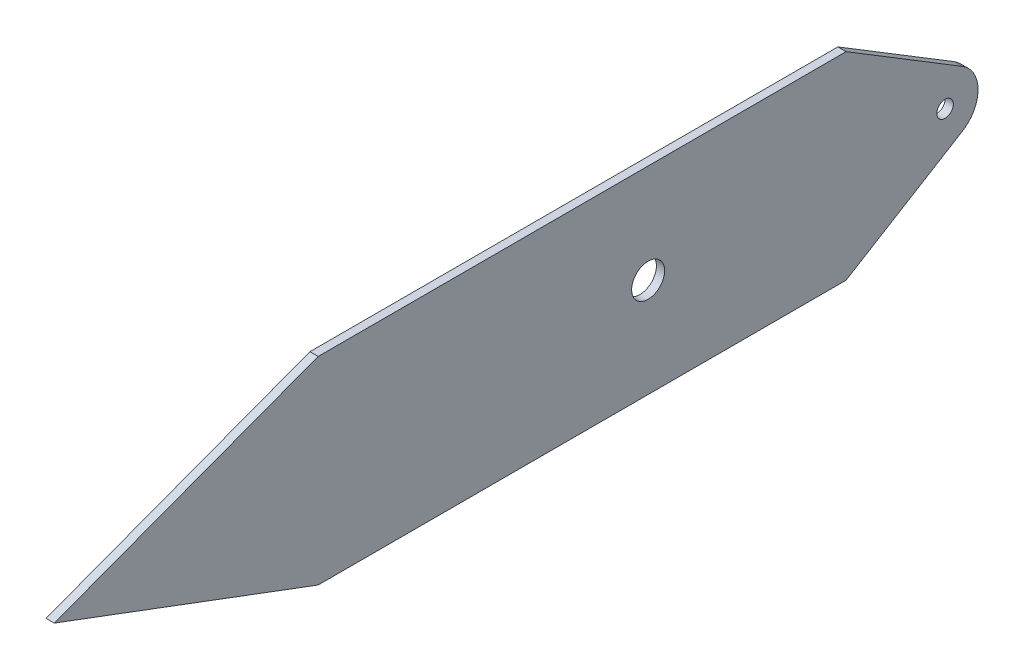
ISO-10303-21;
HEADER;
FILE_DESCRIPTION(('STEP AP214'),'2;1');
FILE_NAME('part.step','',(''),(''),'','','');
FILE_SCHEMA(('AUTOMOTIVE_DESIGN { 1 0 10303 214 1 1 1 1 }'));
ENDSEC;
DATA;
#1=APPLICATION_CONTEXT('core data for automotive mechanical design processes');
#2=APPLICATION_PROTOCOL_DEFINITION('international standard','automotive_design',2000,#1);
#3=PRODUCT_CONTEXT('',#1,'mechanical');
#4=PRODUCT('Part','Part','',(#3));
#5=PRODUCT_RELATED_PRODUCT_CATEGORY('part','',(#4));
#6=PRODUCT_DEFINITION_FORMATION('','',#4);
#7=PRODUCT_DEFINITION_CONTEXT('part definition',#1,'design');
#8=PRODUCT_DEFINITION('design','',#6,#7);
#9=PRODUCT_DEFINITION_SHAPE('','',#8);
#10=(LENGTH_UNIT() NAMED_UNIT(*) SI_UNIT(.MILLI.,.METRE.));
#11=(NAMED_UNIT(*) PLANE_ANGLE_UNIT() SI_UNIT($,.RADIAN.));
#12=(NAMED_UNIT(*) SI_UNIT($,.STERADIAN.) SOLID_ANGLE_UNIT());
#13=UNCERTAINTY_MEASURE_WITH_UNIT(LENGTH_MEASURE(1.E-05),#10,'distance_accuracy_value','');
#14=(GEOMETRIC_REPRESENTATION_CONTEXT(3) GLOBAL_UNCERTAINTY_ASSIGNED_CONTEXT((#13)) GLOBAL_UNIT_ASSIGNED_CONTEXT((#10,
#11,#12)) REPRESENTATION_CONTEXT('',''));
#15=CARTESIAN_POINT('',(0.,0.,0.));
#16=DIRECTION('',(0.,0.,1.));
#17=DIRECTION('',(1.,0.,0.));
#18=AXIS2_PLACEMENT_3D('',#15,#16,#17);
#19=CARTESIAN_POINT('',(3.175,0.,-114.3));
#20=DIRECTION('',(-1.,0.,0.));
#21=DIRECTION('',(0.,0.,1.));
#22=AXIS2_PLACEMENT_3D('',#19,#20,#21);
#23=CYLINDRICAL_SURFACE('',#22,12.7);
#24=CARTESIAN_POINT('',(0.,0.,-114.3));
#25=DIRECTION('',(1.,0.,0.));
#26=DIRECTION('',(0.,0.,-1.));
#27=AXIS2_PLACEMENT_3D('',#24,#25,#26);
#28=CIRCLE('',#27,12.7);
#29=CARTESIAN_POINT('',(0.,-10.8439069075574,-120.910573574224));
#30=VERTEX_POINT('',#29);
#31=CARTESIAN_POINT('',(0.,10.8439069075574,-120.910573574224));
#32=VERTEX_POINT('',#31);
#33=EDGE_CURVE('E138',#30,#32,#28,.T.);
#34=ORIENTED_EDGE('',*,*,#33,.T.);
#35=DIRECTION('',(-1.,0.,0.));
#36=VECTOR('',#35,1.);
#37=CARTESIAN_POINT('',(3.175,10.8439069075574,-120.910573574224));
#38=LINE('',#37,#36);
#39=CARTESIAN_POINT('',(3.175,10.8439069075574,-120.910573574224));
#40=VERTEX_POINT('',#39);
#41=EDGE_CURVE('E11',#40,#32,#38,.T.);
#42=ORIENTED_EDGE('',*,*,#41,.F.);
#43=CARTESIAN_POINT('',(3.175,0.,-114.3));
#44=DIRECTION('',(1.,0.,0.));
#45=DIRECTION('',(0.,0.,-1.));
#46=AXIS2_PLACEMENT_3D('',#43,#44,#45);
#47=CIRCLE('',#46,12.7);
#48=CARTESIAN_POINT('',(3.175,-10.8439069075574,-120.910573574224));
#49=VERTEX_POINT('',#48);
#50=EDGE_CURVE('E180',#49,#40,#47,.T.);
#51=ORIENTED_EDGE('',*,*,#50,.F.);
#52=DIRECTION('',(-1.,0.,0.));
#53=VECTOR('',#52,1.);
#54=CARTESIAN_POINT('',(3.175,-10.8439069075574,-120.910573574224));
#55=LINE('',#54,#53);
#56=EDGE_CURVE('E57',#49,#30,#55,.T.);
#57=ORIENTED_EDGE('',*,*,#56,.T.);
#58=EDGE_LOOP('',(#34,#42,#51,#57));
#59=FACE_BOUND('',#58,.T.);
#60=ADVANCED_FACE('F39',(#59),#23,.T.);
#61=CARTESIAN_POINT('',(3.175,61.6439069075574,-37.5788528515519));
#62=DIRECTION('',(0.,-0.853850937602943,0.52051760426961));
#63=DIRECTION('',(0.,-0.52051760426961,-0.853850937602943));
#64=AXIS2_PLACEMENT_3D('',#61,#62,#63);
#65=PLANE('',#64);
#66=DIRECTION('',(0.,0.52051760426961,0.853850937602943));
#67=VECTOR('',#66,1.);
#68=CARTESIAN_POINT('',(0.,61.6439069075574,-37.5788528515519));
#69=LINE('',#68,#67);
#70=CARTESIAN_POINT('',(0.,38.1,-76.2));
#71=VERTEX_POINT('',#70);
#72=EDGE_CURVE('E139',#32,#71,#69,.T.);
#73=ORIENTED_EDGE('',*,*,#72,.T.);
#74=DIRECTION('',(-1.,0.,0.));
#75=VECTOR('',#74,1.);
#76=CARTESIAN_POINT('',(3.175,38.1,-76.2));
#77=LINE('',#76,#75);
#78=CARTESIAN_POINT('',(3.175,38.1,-76.2));
#79=VERTEX_POINT('',#78);
#80=EDGE_CURVE('E48',#79,#71,#77,.T.);
#81=ORIENTED_EDGE('',*,*,#80,.F.);
#82=DIRECTION('',(0.,0.52051760426961,0.853850937602943));
#83=VECTOR('',#82,1.);
#84=CARTESIAN_POINT('',(3.175,61.6439069075574,-37.5788528515519));
#85=LINE('',#84,#83);
#86=EDGE_CURVE('E91',#40,#79,#85,.T.);
#87=ORIENTED_EDGE('',*,*,#86,.F.);
#88=ORIENTED_EDGE('',*,*,#41,.T.);
#89=EDGE_LOOP('',(#73,#81,#87,#88));
#90=FACE_BOUND('',#89,.T.);
#91=ADVANCED_FACE('F166',(#90),#65,.F.);
#92=CARTESIAN_POINT('',(3.175,38.1,0.));
#93=DIRECTION('',(0.,1.,0.));
#94=DIRECTION('',(0.,0.,1.));
#95=AXIS2_PLACEMENT_3D('',#92,#93,#94);
#96=PLANE('',#95);
#97=DIRECTION('',(0.,0.,-1.));
#98=VECTOR('',#97,1.);
#99=CARTESIAN_POINT('',(0.,38.1,0.));
#100=LINE('',#99,#98);
#101=CARTESIAN_POINT('',(0.,38.1,127.));
#102=VERTEX_POINT('',#101);
#103=EDGE_CURVE('E142',#102,#71,#100,.T.);
#104=ORIENTED_EDGE('',*,*,#103,.F.);
#105=DIRECTION('',(-1.,0.,0.));
#106=VECTOR('',#105,1.);
#107=CARTESIAN_POINT('',(3.175,38.1,127.));
#108=LINE('',#107,#106);
#109=CARTESIAN_POINT('',(3.175,38.1,127.));
#110=VERTEX_POINT('',#109);
#111=EDGE_CURVE('E164',#110,#102,#108,.T.);
#112=ORIENTED_EDGE('',*,*,#111,.F.);
#113=DIRECTION('',(0.,0.,-1.));
#114=VECTOR('',#113,1.);
#115=CARTESIAN_POINT('',(3.175,38.1,0.));
#116=LINE('',#115,#114);
#117=EDGE_CURVE('E167',#110,#79,#116,.T.);
#118=ORIENTED_EDGE('',*,*,#117,.T.);
#119=ORIENTED_EDGE('',*,*,#80,.T.);
#120=EDGE_LOOP('',(#104,#112,#118,#119));
#121=FACE_BOUND('',#120,.T.);
#122=ADVANCED_FACE('F168',(#121),#96,.T.);
#123=CARTESIAN_POINT('',(3.175,75.1561643835616,28.1835616438356));
#124=DIRECTION('',(0.,0.936329177569044,0.351123441588392));
#125=DIRECTION('',(0.,-0.351123441588392,0.936329177569045));
#126=AXIS2_PLACEMENT_3D('',#123,#124,#125);
#127=PLANE('',#126);
#128=DIRECTION('',(0.,0.351123441588392,-0.936329177569045));
#129=VECTOR('',#128,1.);
#130=CARTESIAN_POINT('',(0.,75.1561643835616,28.1835616438356));
#131=LINE('',#130,#129);
#132=CARTESIAN_POINT('',(0.,0.,228.6));
#133=VERTEX_POINT('',#132);
#134=EDGE_CURVE('E147',#133,#102,#131,.T.);
#135=ORIENTED_EDGE('',*,*,#134,.F.);
#136=DIRECTION('',(-1.,0.,0.));
#137=VECTOR('',#136,1.);
#138=CARTESIAN_POINT('',(3.175,0.,228.6));
#139=LINE('',#138,#137);
#140=CARTESIAN_POINT('',(3.175,0.,228.6));
#141=VERTEX_POINT('',#140);
#142=EDGE_CURVE('E111',#141,#133,#139,.T.);
#143=ORIENTED_EDGE('',*,*,#142,.F.);
#144=DIRECTION('',(0.,0.351123441588392,-0.936329177569045));
#145=VECTOR('',#144,1.);
#146=CARTESIAN_POINT('',(3.175,75.1561643835616,28.1835616438356));
#147=LINE('',#146,#145);
#148=EDGE_CURVE('E125',#141,#110,#147,.T.);
#149=ORIENTED_EDGE('',*,*,#148,.T.);
#150=ORIENTED_EDGE('',*,*,#111,.T.);
#151=EDGE_LOOP('',(#135,#143,#149,#150));
#152=FACE_BOUND('',#151,.T.);
#153=ADVANCED_FACE('F172',(#152),#127,.T.);
#154=CARTESIAN_POINT('',(3.175,-75.1561643835616,28.1835616438356));
#155=DIRECTION('',(0.,-0.936329177569044,0.351123441588392));
#156=DIRECTION('',(0.,-0.351123441588392,-0.936329177569045));
#157=AXIS2_PLACEMENT_3D('',#154,#155,#156);
#158=PLANE('',#157);
#159=DIRECTION('',(0.,0.351123441588392,0.936329177569045));
#160=VECTOR('',#159,1.);
#161=CARTESIAN_POINT('',(0.,-75.1561643835616,28.1835616438356));
#162=LINE('',#161,#160);
#163=CARTESIAN_POINT('',(0.,-38.1,127.));
#164=VERTEX_POINT('',#163);
#165=EDGE_CURVE('E106',#164,#133,#162,.T.);
#166=ORIENTED_EDGE('',*,*,#165,.F.);
#167=DIRECTION('',(-1.,0.,0.));
#168=VECTOR('',#167,1.);
#169=CARTESIAN_POINT('',(3.175,-38.1,127.));
#170=LINE('',#169,#168);
#171=CARTESIAN_POINT('',(3.175,-38.1,127.));
#172=VERTEX_POINT('',#171);
#173=EDGE_CURVE('E101',#172,#164,#170,.T.);
#174=ORIENTED_EDGE('',*,*,#173,.F.);
#175=DIRECTION('',(0.,0.351123441588392,0.936329177569045));
#176=VECTOR('',#175,1.);
#177=CARTESIAN_POINT('',(3.175,-75.1561643835616,28.1835616438356));
#178=LINE('',#177,#176);
#179=EDGE_CURVE('E109',#172,#141,#178,.T.);
#180=ORIENTED_EDGE('',*,*,#179,.T.);
#181=ORIENTED_EDGE('',*,*,#142,.T.);
#182=EDGE_LOOP('',(#166,#174,#180,#181));
#183=FACE_BOUND('',#182,.T.);
#184=ADVANCED_FACE('F107',(#183),#158,.T.);
#185=CARTESIAN_POINT('',(3.175,-38.1,0.));
#186=DIRECTION('',(0.,-1.,0.));
#187=DIRECTION('',(0.,0.,-1.));
#188=AXIS2_PLACEMENT_3D('',#185,#186,#187);
#189=PLANE('',#188);
#190=DIRECTION('',(0.,0.,1.));
#191=VECTOR('',#190,1.);
#192=CARTESIAN_POINT('',(0.,-38.1,0.));
#193=LINE('',#192,#191);
#194=CARTESIAN_POINT('',(0.,-38.1,-76.2));
#195=VERTEX_POINT('',#194);
#196=EDGE_CURVE('E148',#195,#164,#193,.T.);
#197=ORIENTED_EDGE('',*,*,#196,.F.);
#198=DIRECTION('',(-1.,0.,0.));
#199=VECTOR('',#198,1.);
#200=CARTESIAN_POINT('',(3.175,-38.1,-76.2));
#201=LINE('',#200,#199);
#202=CARTESIAN_POINT('',(3.175,-38.1,-76.2));
#203=VERTEX_POINT('',#202);
#204=EDGE_CURVE('E80',#203,#195,#201,.T.);
#205=ORIENTED_EDGE('',*,*,#204,.F.);
#206=DIRECTION('',(0.,0.,1.));
#207=VECTOR('',#206,1.);
#208=CARTESIAN_POINT('',(3.175,-38.1,0.));
#209=LINE('',#208,#207);
#210=EDGE_CURVE('E123',#203,#172,#209,.T.);
#211=ORIENTED_EDGE('',*,*,#210,.T.);
#212=ORIENTED_EDGE('',*,*,#173,.T.);
#213=EDGE_LOOP('',(#197,#205,#211,#212));
#214=FACE_BOUND('',#213,.T.);
#215=ADVANCED_FACE('F128',(#214),#189,.T.);
#216=CARTESIAN_POINT('',(3.175,-61.6439069075574,-37.5788528515519));
#217=DIRECTION('',(0.,-0.853850937602943,-0.52051760426961));
#218=DIRECTION('',(0.,0.52051760426961,-0.853850937602943));
#219=AXIS2_PLACEMENT_3D('',#216,#217,#218);
#220=PLANE('',#219);
#221=DIRECTION('',(0.,-0.52051760426961,0.853850937602943));
#222=VECTOR('',#221,1.);
#223=CARTESIAN_POINT('',(0.,-61.6439069075574,-37.5788528515519));
#224=LINE('',#223,#222);
#225=EDGE_CURVE('E154',#30,#195,#224,.T.);
#226=ORIENTED_EDGE('',*,*,#225,.F.);
#227=ORIENTED_EDGE('',*,*,#56,.F.);
#228=DIRECTION('',(0.,-0.52051760426961,0.853850937602943));
#229=VECTOR('',#228,1.);
#230=CARTESIAN_POINT('',(3.175,-61.6439069075574,-37.5788528515519));
#231=LINE('',#230,#229);
#232=EDGE_CURVE('E130',#49,#203,#231,.T.);
#233=ORIENTED_EDGE('',*,*,#232,.T.);
#234=ORIENTED_EDGE('',*,*,#204,.T.);
#235=EDGE_LOOP('',(#226,#227,#233,#234));
#236=FACE_BOUND('',#235,.T.);
#237=ADVANCED_FACE('F213',(#236),#220,.T.);
#238=CARTESIAN_POINT('',(3.175,0.,0.));
#239=DIRECTION('',(-1.,0.,0.));
#240=DIRECTION('',(0.,0.,1.));
#241=AXIS2_PLACEMENT_3D('',#238,#239,#240);
#242=CYLINDRICAL_SURFACE('',#241,6.35);
#243=CARTESIAN_POINT('',(3.175,0.,0.));
#244=DIRECTION('',(1.,0.,0.));
#245=DIRECTION('',(0.,0.,-1.));
#246=AXIS2_PLACEMENT_3D('',#243,#244,#245);
#247=CIRCLE('',#246,6.35);
#248=CARTESIAN_POINT('',(3.175,0.,-6.35));
#249=VERTEX_POINT('',#248);
#250=EDGE_CURVE('E156',#249,#249,#247,.T.);
#251=ORIENTED_EDGE('',*,*,#250,.T.);
#252=EDGE_LOOP('',(#251));
#253=FACE_BOUND('',#252,.T.);
#254=CARTESIAN_POINT('',(0.,0.,0.));
#255=DIRECTION('',(1.,0.,0.));
#256=DIRECTION('',(0.,0.,-1.));
#257=AXIS2_PLACEMENT_3D('',#254,#255,#256);
#258=CIRCLE('',#257,6.35);
#259=CARTESIAN_POINT('',(0.,0.,-6.35));
#260=VERTEX_POINT('',#259);
#261=EDGE_CURVE('E134',#260,#260,#258,.T.);
#262=ORIENTED_EDGE('',*,*,#261,.F.);
#263=EDGE_LOOP('',(#262));
#264=FACE_BOUND('',#263,.T.);
#265=ADVANCED_FACE('F41',(#253,#264),#242,.F.);
#266=CARTESIAN_POINT('',(3.175,0.,-114.3));
#267=DIRECTION('',(-1.,0.,0.));
#268=DIRECTION('',(0.,0.,1.));
#269=AXIS2_PLACEMENT_3D('',#266,#267,#268);
#270=CYLINDRICAL_SURFACE('',#269,3.175);
#271=CARTESIAN_POINT('',(3.175,0.,-114.3));
#272=DIRECTION('',(1.,0.,0.));
#273=DIRECTION('',(0.,0.,-1.));
#274=AXIS2_PLACEMENT_3D('',#271,#272,#273);
#275=CIRCLE('',#274,3.175);
#276=CARTESIAN_POINT('',(3.175,0.,-117.475));
#277=VERTEX_POINT('',#276);
#278=EDGE_CURVE('E129',#277,#277,#275,.T.);
#279=ORIENTED_EDGE('',*,*,#278,.T.);
#280=EDGE_LOOP('',(#279));
#281=FACE_BOUND('',#280,.T.);
#282=CARTESIAN_POINT('',(0.,0.,-114.3));
#283=DIRECTION('',(1.,0.,0.));
#284=DIRECTION('',(0.,0.,-1.));
#285=AXIS2_PLACEMENT_3D('',#282,#283,#284);
#286=CIRCLE('',#285,3.175);
#287=CARTESIAN_POINT('',(0.,0.,-117.475));
#288=VERTEX_POINT('',#287);
#289=EDGE_CURVE('E153',#288,#288,#286,.T.);
#290=ORIENTED_EDGE('',*,*,#289,.F.);
#291=EDGE_LOOP('',(#290));
#292=FACE_BOUND('',#291,.T.);
#293=ADVANCED_FACE('F190',(#281,#292),#270,.F.);
#294=CARTESIAN_POINT('',(3.175,0.,0.));
#295=DIRECTION('',(1.,0.,0.));
#296=DIRECTION('',(0.,0.,-1.));
#297=AXIS2_PLACEMENT_3D('',#294,#295,#296);
#298=PLANE('',#297);
#299=ORIENTED_EDGE('',*,*,#250,.F.);
#300=EDGE_LOOP('',(#299));
#301=FACE_BOUND('',#300,.T.);
#302=ORIENTED_EDGE('',*,*,#50,.T.);
#303=ORIENTED_EDGE('',*,*,#86,.T.);
#304=ORIENTED_EDGE('',*,*,#117,.F.);
#305=ORIENTED_EDGE('',*,*,#148,.F.);
#306=ORIENTED_EDGE('',*,*,#179,.F.);
#307=ORIENTED_EDGE('',*,*,#210,.F.);
#308=ORIENTED_EDGE('',*,*,#232,.F.);
#309=EDGE_LOOP('',(#302,#303,#304,#305,#306,#307,#308));
#310=FACE_BOUND('',#309,.T.);
#311=ORIENTED_EDGE('',*,*,#278,.F.);
#312=EDGE_LOOP('',(#311));
#313=FACE_BOUND('',#312,.T.);
#314=ADVANCED_FACE('F120',(#301,#310,#313),#298,.T.);
#315=CARTESIAN_POINT('',(0.,0.,0.));
#316=DIRECTION('',(1.,0.,0.));
#317=DIRECTION('',(0.,0.,-1.));
#318=AXIS2_PLACEMENT_3D('',#315,#316,#317);
#319=PLANE('',#318);
#320=ORIENTED_EDGE('',*,*,#261,.T.);
#321=EDGE_LOOP('',(#320));
#322=FACE_BOUND('',#321,.T.);
#323=ORIENTED_EDGE('',*,*,#33,.F.);
#324=ORIENTED_EDGE('',*,*,#225,.T.);
#325=ORIENTED_EDGE('',*,*,#196,.T.);
#326=ORIENTED_EDGE('',*,*,#165,.T.);
#327=ORIENTED_EDGE('',*,*,#134,.T.);
#328=ORIENTED_EDGE('',*,*,#103,.T.);
#329=ORIENTED_EDGE('',*,*,#72,.F.);
#330=EDGE_LOOP('',(#323,#324,#325,#326,#327,#328,#329));
#331=FACE_BOUND('',#330,.T.);
#332=ORIENTED_EDGE('',*,*,#289,.T.);
#333=EDGE_LOOP('',(#332));
#334=FACE_BOUND('',#333,.T.);
#335=ADVANCED_FACE('F173',(#322,#331,#334),#319,.F.);
#336=CLOSED_SHELL('',(#60,#91,#122,#153,#184,#215,#237,#265,#293,#314,#335));
#337=MANIFOLD_SOLID_BREP('B2',#336);
#338=ADVANCED_BREP_SHAPE_REPRESENTATION('',(#18,#337),#14);
#339=SHAPE_DEFINITION_REPRESENTATION(#9,#338);
ENDSEC;
END-ISO-10303-21;
